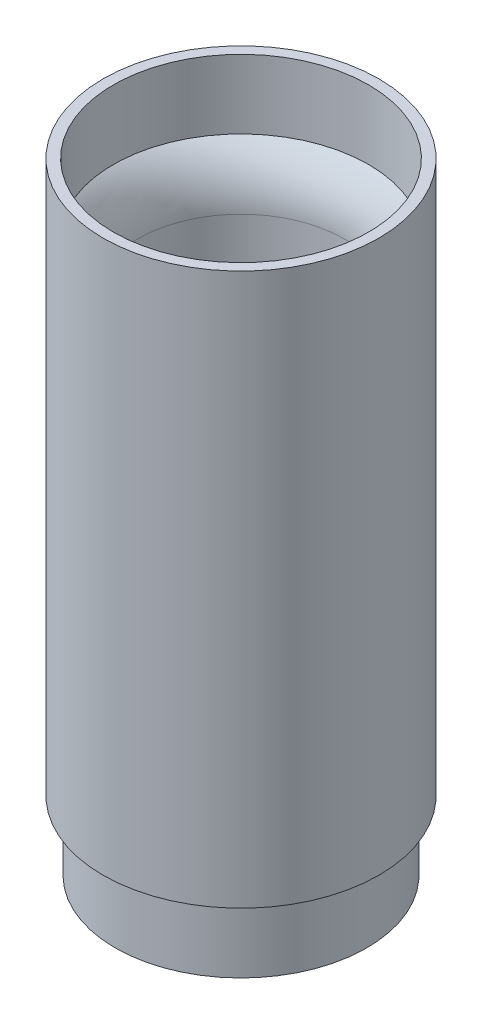
ISO-10303-21;
HEADER;
FILE_DESCRIPTION(('STEP AP214'),'2;1');
FILE_NAME('part.step','',(''),(''),'','','');
FILE_SCHEMA(('AUTOMOTIVE_DESIGN { 1 0 10303 214 1 1 1 1 }'));
ENDSEC;
DATA;
#1=APPLICATION_CONTEXT('core data for automotive mechanical design processes');
#2=APPLICATION_PROTOCOL_DEFINITION('international standard','automotive_design',2000,#1);
#3=PRODUCT_CONTEXT('',#1,'mechanical');
#4=PRODUCT('Part','Part','',(#3));
#5=PRODUCT_RELATED_PRODUCT_CATEGORY('part','',(#4));
#6=PRODUCT_DEFINITION_FORMATION('','',#4);
#7=PRODUCT_DEFINITION_CONTEXT('part definition',#1,'design');
#8=PRODUCT_DEFINITION('design','',#6,#7);
#9=PRODUCT_DEFINITION_SHAPE('','',#8);
#10=(LENGTH_UNIT() NAMED_UNIT(*) SI_UNIT(.MILLI.,.METRE.));
#11=(NAMED_UNIT(*) PLANE_ANGLE_UNIT() SI_UNIT($,.RADIAN.));
#12=(NAMED_UNIT(*) SI_UNIT($,.STERADIAN.) SOLID_ANGLE_UNIT());
#13=UNCERTAINTY_MEASURE_WITH_UNIT(LENGTH_MEASURE(1.E-05),#10,'distance_accuracy_value','');
#14=(GEOMETRIC_REPRESENTATION_CONTEXT(3) GLOBAL_UNCERTAINTY_ASSIGNED_CONTEXT((#13)) GLOBAL_UNIT_ASSIGNED_CONTEXT((#10,
#11,#12)) REPRESENTATION_CONTEXT('',''));
#15=CARTESIAN_POINT('',(0.,0.,0.));
#16=DIRECTION('',(0.,0.,1.));
#17=DIRECTION('',(1.,0.,0.));
#18=AXIS2_PLACEMENT_3D('',#15,#16,#17);
#19=CARTESIAN_POINT('',(0.,10.,0.));
#20=DIRECTION('',(0.,-1.,0.));
#21=DIRECTION('',(0.,0.,-1.));
#22=AXIS2_PLACEMENT_3D('',#19,#20,#21);
#23=CYLINDRICAL_SURFACE('',#22,18.25);
#24=CARTESIAN_POINT('',(0.,10.,0.));
#25=DIRECTION('',(0.,1.,0.));
#26=DIRECTION('',(0.,0.,1.));
#27=AXIS2_PLACEMENT_3D('',#24,#25,#26);
#28=CIRCLE('',#27,18.25);
#29=CARTESIAN_POINT('',(0.,10.,18.25));
#30=VERTEX_POINT('',#29);
#31=EDGE_CURVE('E49',#30,#30,#28,.T.);
#32=ORIENTED_EDGE('',*,*,#31,.F.);
#33=EDGE_LOOP('',(#32));
#34=FACE_BOUND('',#33,.T.);
#35=CARTESIAN_POINT('',(0.,0.,0.));
#36=DIRECTION('',(0.,1.,0.));
#37=DIRECTION('',(0.,0.,1.));
#38=AXIS2_PLACEMENT_3D('',#35,#36,#37);
#39=CIRCLE('',#38,18.25);
#40=CARTESIAN_POINT('',(0.,0.,18.25));
#41=VERTEX_POINT('',#40);
#42=EDGE_CURVE('E52',#41,#41,#39,.T.);
#43=ORIENTED_EDGE('',*,*,#42,.T.);
#44=EDGE_LOOP('',(#43));
#45=FACE_BOUND('',#44,.T.);
#46=ADVANCED_FACE('F34',(#34,#45),#23,.T.);
#47=CARTESIAN_POINT('',(0.,0.,0.));
#48=DIRECTION('',(0.,1.,0.));
#49=DIRECTION('',(0.,0.,1.));
#50=AXIS2_PLACEMENT_3D('',#47,#48,#49);
#51=PLANE('',#50);
#52=CARTESIAN_POINT('',(0.,0.,0.));
#53=DIRECTION('',(0.,-1.,0.));
#54=DIRECTION('',(0.,0.,-1.));
#55=AXIS2_PLACEMENT_3D('',#52,#53,#54);
#56=CIRCLE('',#55,15.);
#57=CARTESIAN_POINT('',(0.,0.,-15.));
#58=VERTEX_POINT('',#57);
#59=EDGE_CURVE('E58',#58,#58,#56,.T.);
#60=ORIENTED_EDGE('',*,*,#59,.F.);
#61=EDGE_LOOP('',(#60));
#62=FACE_BOUND('',#61,.T.);
#63=ORIENTED_EDGE('',*,*,#42,.F.);
#64=EDGE_LOOP('',(#63));
#65=FACE_BOUND('',#64,.T.);
#66=ADVANCED_FACE('F91',(#62,#65),#51,.F.);
#67=CARTESIAN_POINT('',(0.,8.,0.));
#68=DIRECTION('',(0.,-1.,0.));
#69=DIRECTION('',(0.,0.,-1.));
#70=AXIS2_PLACEMENT_3D('',#67,#68,#69);
#71=CYLINDRICAL_SURFACE('',#70,15.);
#72=CARTESIAN_POINT('',(0.,8.,0.));
#73=DIRECTION('',(0.,-1.,0.));
#74=DIRECTION('',(0.,0.,-1.));
#75=AXIS2_PLACEMENT_3D('',#72,#73,#74);
#76=CIRCLE('',#75,15.);
#77=CARTESIAN_POINT('',(0.,8.,-15.));
#78=VERTEX_POINT('',#77);
#79=EDGE_CURVE('E55',#78,#78,#76,.T.);
#80=ORIENTED_EDGE('',*,*,#79,.F.);
#81=EDGE_LOOP('',(#80));
#82=FACE_BOUND('',#81,.T.);
#83=ORIENTED_EDGE('',*,*,#59,.T.);
#84=EDGE_LOOP('',(#83));
#85=FACE_BOUND('',#84,.T.);
#86=ADVANCED_FACE('F96',(#82,#85),#71,.F.);
#87=CARTESIAN_POINT('',(0.,8.,0.));
#88=DIRECTION('',(0.,-1.,0.));
#89=DIRECTION('',(0.,0.,-1.));
#90=AXIS2_PLACEMENT_3D('',#87,#88,#89);
#91=PLANE('',#90);
#92=ORIENTED_EDGE('',*,*,#79,.T.);
#93=EDGE_LOOP('',(#92));
#94=FACE_BOUND('',#93,.T.);
#95=ADVANCED_FACE('F108',(#94),#91,.T.);
#96=CARTESIAN_POINT('',(0.,10.,0.));
#97=DIRECTION('',(0.,1.,0.));
#98=DIRECTION('',(0.,0.,1.));
#99=AXIS2_PLACEMENT_3D('',#96,#97,#98);
#100=PLANE('',#99);
#101=ORIENTED_EDGE('',*,*,#31,.T.);
#102=EDGE_LOOP('',(#101));
#103=FACE_BOUND('',#102,.T.);
#104=CARTESIAN_POINT('',(0.,10.,0.));
#105=DIRECTION('',(0.,1.,0.));
#106=DIRECTION('',(0.,0.,1.));
#107=AXIS2_PLACEMENT_3D('',#104,#105,#106);
#108=CIRCLE('',#107,20.);
#109=CARTESIAN_POINT('',(0.,10.,20.));
#110=VERTEX_POINT('',#109);
#111=EDGE_CURVE('E61',#110,#110,#108,.T.);
#112=ORIENTED_EDGE('',*,*,#111,.F.);
#113=EDGE_LOOP('',(#112));
#114=FACE_BOUND('',#113,.T.);
#115=ADVANCED_FACE('F86',(#103,#114),#100,.F.);
#116=CARTESIAN_POINT('',(0.,80.,0.));
#117=DIRECTION('',(0.,-1.,0.));
#118=DIRECTION('',(0.,0.,-1.));
#119=AXIS2_PLACEMENT_3D('',#116,#117,#118);
#120=CYLINDRICAL_SURFACE('',#119,20.);
#121=ORIENTED_EDGE('',*,*,#111,.T.);
#122=EDGE_LOOP('',(#121));
#123=FACE_BOUND('',#122,.T.);
#124=CARTESIAN_POINT('',(0.,90.,0.));
#125=DIRECTION('',(0.,1.,0.));
#126=DIRECTION('',(0.,0.,1.));
#127=AXIS2_PLACEMENT_3D('',#124,#125,#126);
#128=CIRCLE('',#127,20.);
#129=CARTESIAN_POINT('',(0.,90.,20.));
#130=VERTEX_POINT('',#129);
#131=EDGE_CURVE('E66',#130,#130,#128,.T.);
#132=ORIENTED_EDGE('',*,*,#131,.F.);
#133=EDGE_LOOP('',(#132));
#134=FACE_BOUND('',#133,.T.);
#135=ADVANCED_FACE('F77',(#123,#134),#120,.T.);
#136=CARTESIAN_POINT('',(0.,90.,0.));
#137=DIRECTION('',(0.,1.,0.));
#138=DIRECTION('',(0.,0.,1.));
#139=AXIS2_PLACEMENT_3D('',#136,#137,#138);
#140=PLANE('',#139);
#141=ORIENTED_EDGE('',*,*,#131,.T.);
#142=EDGE_LOOP('',(#141));
#143=FACE_BOUND('',#142,.T.);
#144=CARTESIAN_POINT('',(0.,90.,0.));
#145=DIRECTION('',(0.,1.,0.));
#146=DIRECTION('',(0.,0.,1.));
#147=AXIS2_PLACEMENT_3D('',#144,#145,#146);
#148=CIRCLE('',#147,18.5);
#149=CARTESIAN_POINT('',(0.,90.,18.5));
#150=VERTEX_POINT('',#149);
#151=EDGE_CURVE('E69',#150,#150,#148,.T.);
#152=ORIENTED_EDGE('',*,*,#151,.F.);
#153=EDGE_LOOP('',(#152));
#154=FACE_BOUND('',#153,.T.);
#155=ADVANCED_FACE('F75',(#143,#154),#140,.T.);
#156=CARTESIAN_POINT('',(0.,90.,0.));
#157=DIRECTION('',(0.,-1.,0.));
#158=DIRECTION('',(0.,0.,-1.));
#159=AXIS2_PLACEMENT_3D('',#156,#157,#158);
#160=CYLINDRICAL_SURFACE('',#159,18.5);
#161=ORIENTED_EDGE('',*,*,#151,.T.);
#162=EDGE_LOOP('',(#161));
#163=FACE_BOUND('',#162,.T.);
#164=CARTESIAN_POINT('',(0.,80.,0.));
#165=DIRECTION('',(0.,1.,0.));
#166=DIRECTION('',(0.,0.,1.));
#167=AXIS2_PLACEMENT_3D('',#164,#165,#166);
#168=CIRCLE('',#167,18.5);
#169=CARTESIAN_POINT('',(0.,80.,18.5));
#170=VERTEX_POINT('',#169);
#171=EDGE_CURVE('E41',#170,#170,#168,.F.);
#172=ORIENTED_EDGE('',*,*,#171,.T.);
#173=EDGE_LOOP('',(#172));
#174=FACE_BOUND('',#173,.T.);
#175=ADVANCED_FACE('F73',(#163,#174),#160,.F.);
#176=CARTESIAN_POINT('',(0.,10.,0.));
#177=DIRECTION('',(0.,1.,0.));
#178=DIRECTION('',(0.,0.,1.));
#179=AXIS2_PLACEMENT_3D('',#176,#177,#178);
#180=PLANE('',#179);
#181=CARTESIAN_POINT('',(0.,9.99999999999999,0.));
#182=DIRECTION('',(0.,1.,0.));
#183=DIRECTION('',(0.,0.,1.));
#184=AXIS2_PLACEMENT_3D('',#181,#182,#183);
#185=CIRCLE('',#184,15.);
#186=CARTESIAN_POINT('',(0.,9.99999999999999,15.));
#187=VERTEX_POINT('',#186);
#188=EDGE_CURVE('E45',#187,#187,#185,.F.);
#189=ORIENTED_EDGE('',*,*,#188,.F.);
#190=EDGE_LOOP('',(#189));
#191=FACE_BOUND('',#190,.T.);
#192=ADVANCED_FACE('F84',(#191),#180,.T.);
#193=CARTESIAN_POINT('',(0.,80.,0.));
#194=DIRECTION('',(0.,-1.,0.));
#195=DIRECTION('',(0.,0.,-1.));
#196=AXIS2_PLACEMENT_3D('',#193,#194,#195);
#197=CYLINDRICAL_SURFACE('',#196,15.);
#198=CARTESIAN_POINT('',(0.,72.4006579232147,0.));
#199=DIRECTION('',(0.,1.,0.));
#200=DIRECTION('',(0.,0.,1.));
#201=AXIS2_PLACEMENT_3D('',#198,#199,#200);
#202=CIRCLE('',#201,15.);
#203=CARTESIAN_POINT('',(0.,72.4006579232147,15.));
#204=VERTEX_POINT('',#203);
#205=EDGE_CURVE('E10',#204,#204,#202,.T.);
#206=ORIENTED_EDGE('',*,*,#205,.T.);
#207=EDGE_LOOP('',(#206));
#208=FACE_BOUND('',#207,.T.);
#209=ORIENTED_EDGE('',*,*,#188,.T.);
#210=EDGE_LOOP('',(#209));
#211=FACE_BOUND('',#210,.T.);
#212=ADVANCED_FACE('F104',(#208,#211),#197,.F.);
#213=CARTESIAN_POINT('',(0.,72.4006579232147,0.));
#214=DIRECTION('',(0.,1.,0.));
#215=DIRECTION('',(0.,0.,1.));
#216=AXIS2_PLACEMENT_3D('',#213,#214,#215);
#217=TOROIDAL_SURFACE('',#216,25.,10.);
#218=ORIENTED_EDGE('',*,*,#171,.F.);
#219=EDGE_LOOP('',(#218));
#220=FACE_BOUND('',#219,.T.);
#221=ORIENTED_EDGE('',*,*,#205,.F.);
#222=EDGE_LOOP('',(#221));
#223=FACE_BOUND('',#222,.T.);
#224=ADVANCED_FACE('F36',(#220,#223),#217,.T.);
#225=CLOSED_SHELL('',(#46,#66,#86,#95,#115,#135,#155,#175,#192,#212,#224));
#226=MANIFOLD_SOLID_BREP('B2',#225);
#227=ADVANCED_BREP_SHAPE_REPRESENTATION('',(#18,#226),#14);
#228=SHAPE_DEFINITION_REPRESENTATION(#9,#227);
ENDSEC;
END-ISO-10303-21;
